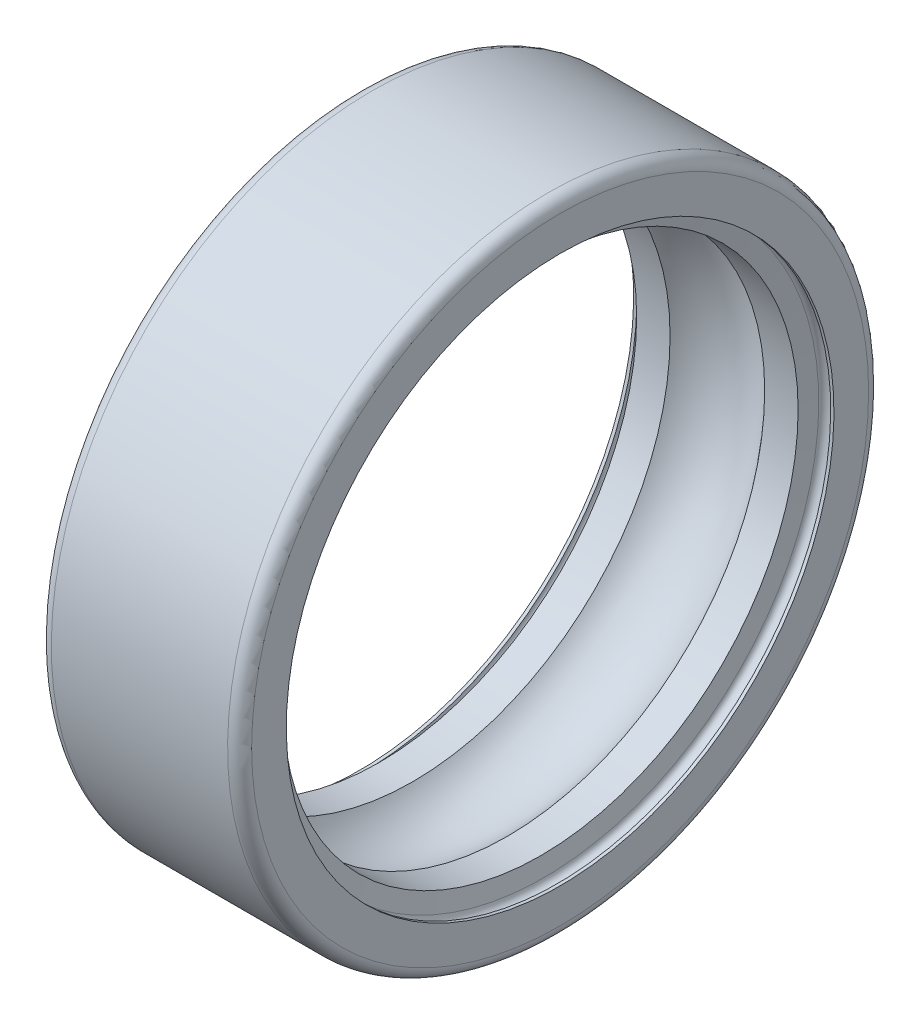
ISO-10303-21;
HEADER;
FILE_DESCRIPTION(('STEP AP214'),'2;1');
FILE_NAME('part.step','',(''),(''),'','','');
FILE_SCHEMA(('AUTOMOTIVE_DESIGN { 1 0 10303 214 1 1 1 1 }'));
ENDSEC;
DATA;
#1=APPLICATION_CONTEXT('core data for automotive mechanical design processes');
#2=APPLICATION_PROTOCOL_DEFINITION('international standard','automotive_design',2000,#1);
#3=PRODUCT_CONTEXT('',#1,'mechanical');
#4=PRODUCT('Part','Part','',(#3));
#5=PRODUCT_RELATED_PRODUCT_CATEGORY('part','',(#4));
#6=PRODUCT_DEFINITION_FORMATION('','',#4);
#7=PRODUCT_DEFINITION_CONTEXT('part definition',#1,'design');
#8=PRODUCT_DEFINITION('design','',#6,#7);
#9=PRODUCT_DEFINITION_SHAPE('','',#8);
#10=(LENGTH_UNIT() NAMED_UNIT(*) SI_UNIT(.MILLI.,.METRE.));
#11=(NAMED_UNIT(*) PLANE_ANGLE_UNIT() SI_UNIT($,.RADIAN.));
#12=(NAMED_UNIT(*) SI_UNIT($,.STERADIAN.) SOLID_ANGLE_UNIT());
#13=UNCERTAINTY_MEASURE_WITH_UNIT(LENGTH_MEASURE(1.E-05),#10,'distance_accuracy_value','');
#14=(GEOMETRIC_REPRESENTATION_CONTEXT(3) GLOBAL_UNCERTAINTY_ASSIGNED_CONTEXT((#13)) GLOBAL_UNIT_ASSIGNED_CONTEXT((#10,
#11,#12)) REPRESENTATION_CONTEXT('',''));
#15=CARTESIAN_POINT('',(0.,0.,0.));
#16=DIRECTION('',(0.,0.,1.));
#17=DIRECTION('',(1.,0.,0.));
#18=AXIS2_PLACEMENT_3D('',#15,#16,#17);
#19=CARTESIAN_POINT('',(9.508,0.,0.));
#20=DIRECTION('',(1.,0.,0.));
#21=DIRECTION('',(0.,0.,-1.));
#22=AXIS2_PLACEMENT_3D('',#19,#20,#21);
#23=TOROIDAL_SURFACE('',#22,13.67,0.328);
#24=CARTESIAN_POINT('',(9.836,0.,0.));
#25=DIRECTION('',(1.,0.,0.));
#26=DIRECTION('',(0.,1.,0.));
#27=AXIS2_PLACEMENT_3D('',#24,#25,#26);
#28=CIRCLE('',#27,13.67);
#29=CARTESIAN_POINT('',(9.836,13.67,0.));
#30=VERTEX_POINT('',#29);
#31=EDGE_CURVE('E10',#30,#30,#28,.T.);
#32=ORIENTED_EDGE('',*,*,#31,.T.);
#33=EDGE_LOOP('',(#32));
#34=FACE_BOUND('',#33,.T.);
#35=CARTESIAN_POINT('',(9.18498305701199,0.,0.));
#36=DIRECTION('',(1.,0.,0.));
#37=DIRECTION('',(0.,1.,0.));
#38=AXIS2_PLACEMENT_3D('',#35,#36,#37);
#39=CIRCLE('',#38,13.7269566022747);
#40=CARTESIAN_POINT('',(9.18498305701199,13.7269566022747,0.));
#41=VERTEX_POINT('',#40);
#42=EDGE_CURVE('E82',#41,#41,#39,.T.);
#43=ORIENTED_EDGE('',*,*,#42,.F.);
#44=EDGE_LOOP('',(#43));
#45=FACE_BOUND('',#44,.T.);
#46=ADVANCED_FACE('F15',(#34,#45),#23,.F.);
#47=CARTESIAN_POINT('',(9.918,0.,0.));
#48=DIRECTION('',(-1.,0.,0.));
#49=DIRECTION('',(0.,1.,0.));
#50=AXIS2_PLACEMENT_3D('',#47,#48,#49);
#51=CYLINDRICAL_SURFACE('',#50,13.67);
#52=CARTESIAN_POINT('',(10.,0.,0.));
#53=DIRECTION('',(1.,0.,0.));
#54=DIRECTION('',(0.,1.,0.));
#55=AXIS2_PLACEMENT_3D('',#52,#53,#54);
#56=CIRCLE('',#55,13.67);
#57=CARTESIAN_POINT('',(10.,13.67,0.));
#58=VERTEX_POINT('',#57);
#59=EDGE_CURVE('E25',#58,#58,#56,.T.);
#60=ORIENTED_EDGE('',*,*,#59,.T.);
#61=EDGE_LOOP('',(#60));
#62=FACE_BOUND('',#61,.T.);
#63=ORIENTED_EDGE('',*,*,#31,.F.);
#64=EDGE_LOOP('',(#63));
#65=FACE_BOUND('',#64,.T.);
#66=ADVANCED_FACE('F121',(#62,#65),#51,.F.);
#67=CARTESIAN_POINT('',(10.,14.535,0.));
#68=DIRECTION('',(1.,0.,0.));
#69=DIRECTION('',(0.,1.,0.));
#70=AXIS2_PLACEMENT_3D('',#67,#68,#69);
#71=PLANE('',#70);
#72=CARTESIAN_POINT('',(10.,0.,0.));
#73=DIRECTION('',(1.,0.,0.));
#74=DIRECTION('',(0.,1.,0.));
#75=AXIS2_PLACEMENT_3D('',#72,#73,#74);
#76=CIRCLE('',#75,15.4);
#77=CARTESIAN_POINT('',(10.,15.4,0.));
#78=VERTEX_POINT('',#77);
#79=EDGE_CURVE('E87',#78,#78,#76,.T.);
#80=ORIENTED_EDGE('',*,*,#79,.T.);
#81=EDGE_LOOP('',(#80));
#82=FACE_BOUND('',#81,.T.);
#83=ORIENTED_EDGE('',*,*,#59,.F.);
#84=EDGE_LOOP('',(#83));
#85=FACE_BOUND('',#84,.T.);
#86=ADVANCED_FACE('F125',(#82,#85),#71,.T.);
#87=CARTESIAN_POINT('',(9.4,0.,0.));
#88=DIRECTION('',(1.,0.,0.));
#89=DIRECTION('',(0.,0.,-1.));
#90=AXIS2_PLACEMENT_3D('',#87,#88,#89);
#91=TOROIDAL_SURFACE('',#90,15.4,0.6);
#92=CARTESIAN_POINT('',(9.4,0.,0.));
#93=DIRECTION('',(1.,0.,0.));
#94=DIRECTION('',(0.,1.,0.));
#95=AXIS2_PLACEMENT_3D('',#92,#93,#94);
#96=CIRCLE('',#95,16.);
#97=CARTESIAN_POINT('',(9.4,16.,0.));
#98=VERTEX_POINT('',#97);
#99=EDGE_CURVE('E85',#98,#98,#96,.T.);
#100=ORIENTED_EDGE('',*,*,#99,.T.);
#101=EDGE_LOOP('',(#100));
#102=FACE_BOUND('',#101,.T.);
#103=ORIENTED_EDGE('',*,*,#79,.F.);
#104=EDGE_LOOP('',(#103));
#105=FACE_BOUND('',#104,.T.);
#106=ADVANCED_FACE('F129',(#102,#105),#91,.T.);
#107=CARTESIAN_POINT('',(5.,0.,0.));
#108=DIRECTION('',(-1.,0.,0.));
#109=DIRECTION('',(0.,1.,0.));
#110=AXIS2_PLACEMENT_3D('',#107,#108,#109);
#111=CYLINDRICAL_SURFACE('',#110,16.);
#112=CARTESIAN_POINT('',(0.6,0.,0.));
#113=DIRECTION('',(1.,0.,0.));
#114=DIRECTION('',(0.,1.,0.));
#115=AXIS2_PLACEMENT_3D('',#112,#113,#114);
#116=CIRCLE('',#115,16.);
#117=CARTESIAN_POINT('',(0.6,16.,0.));
#118=VERTEX_POINT('',#117);
#119=EDGE_CURVE('E83',#118,#118,#116,.T.);
#120=ORIENTED_EDGE('',*,*,#119,.T.);
#121=EDGE_LOOP('',(#120));
#122=FACE_BOUND('',#121,.T.);
#123=ORIENTED_EDGE('',*,*,#99,.F.);
#124=EDGE_LOOP('',(#123));
#125=FACE_BOUND('',#124,.T.);
#126=ADVANCED_FACE('F131',(#122,#125),#111,.T.);
#127=CARTESIAN_POINT('',(0.6,0.,0.));
#128=DIRECTION('',(1.,0.,0.));
#129=DIRECTION('',(0.,0.,-1.));
#130=AXIS2_PLACEMENT_3D('',#127,#128,#129);
#131=TOROIDAL_SURFACE('',#130,15.4,0.6);
#132=CARTESIAN_POINT('',(0.,0.,0.));
#133=DIRECTION('',(1.,0.,0.));
#134=DIRECTION('',(0.,1.,0.));
#135=AXIS2_PLACEMENT_3D('',#132,#133,#134);
#136=CIRCLE('',#135,15.4);
#137=CARTESIAN_POINT('',(0.,15.4,0.));
#138=VERTEX_POINT('',#137);
#139=EDGE_CURVE('E86',#138,#138,#136,.T.);
#140=ORIENTED_EDGE('',*,*,#139,.T.);
#141=EDGE_LOOP('',(#140));
#142=FACE_BOUND('',#141,.T.);
#143=ORIENTED_EDGE('',*,*,#119,.F.);
#144=EDGE_LOOP('',(#143));
#145=FACE_BOUND('',#144,.T.);
#146=ADVANCED_FACE('F156',(#142,#145),#131,.T.);
#147=CARTESIAN_POINT('',(0.,14.535,0.));
#148=DIRECTION('',(-1.,0.,0.));
#149=DIRECTION('',(0.,-1.,0.));
#150=AXIS2_PLACEMENT_3D('',#147,#148,#149);
#151=PLANE('',#150);
#152=CARTESIAN_POINT('',(0.,0.,0.));
#153=DIRECTION('',(1.,0.,0.));
#154=DIRECTION('',(0.,1.,0.));
#155=AXIS2_PLACEMENT_3D('',#152,#153,#154);
#156=CIRCLE('',#155,13.67);
#157=CARTESIAN_POINT('',(0.,13.67,0.));
#158=VERTEX_POINT('',#157);
#159=EDGE_CURVE('E88',#158,#158,#156,.T.);
#160=ORIENTED_EDGE('',*,*,#159,.T.);
#161=EDGE_LOOP('',(#160));
#162=FACE_BOUND('',#161,.T.);
#163=ORIENTED_EDGE('',*,*,#139,.F.);
#164=EDGE_LOOP('',(#163));
#165=FACE_BOUND('',#164,.T.);
#166=ADVANCED_FACE('F148',(#162,#165),#151,.T.);
#167=CARTESIAN_POINT('',(0.081999999999999,0.,0.));
#168=DIRECTION('',(-1.,0.,0.));
#169=DIRECTION('',(0.,1.,0.));
#170=AXIS2_PLACEMENT_3D('',#167,#168,#169);
#171=CYLINDRICAL_SURFACE('',#170,13.67);
#172=CARTESIAN_POINT('',(0.164,0.,0.));
#173=DIRECTION('',(1.,0.,0.));
#174=DIRECTION('',(0.,1.,0.));
#175=AXIS2_PLACEMENT_3D('',#172,#173,#174);
#176=CIRCLE('',#175,13.67);
#177=CARTESIAN_POINT('',(0.164,13.67,0.));
#178=VERTEX_POINT('',#177);
#179=EDGE_CURVE('E74',#178,#178,#176,.T.);
#180=ORIENTED_EDGE('',*,*,#179,.T.);
#181=EDGE_LOOP('',(#180));
#182=FACE_BOUND('',#181,.T.);
#183=ORIENTED_EDGE('',*,*,#159,.F.);
#184=EDGE_LOOP('',(#183));
#185=FACE_BOUND('',#184,.T.);
#186=ADVANCED_FACE('F143',(#182,#185),#171,.F.);
#187=CARTESIAN_POINT('',(0.492,0.,0.));
#188=DIRECTION('',(1.,0.,0.));
#189=DIRECTION('',(0.,0.,-1.));
#190=AXIS2_PLACEMENT_3D('',#187,#188,#189);
#191=TOROIDAL_SURFACE('',#190,13.67,0.328);
#192=CARTESIAN_POINT('',(0.815016942988004,0.,0.));
#193=DIRECTION('',(1.,0.,0.));
#194=DIRECTION('',(0.,1.,0.));
#195=AXIS2_PLACEMENT_3D('',#192,#193,#194);
#196=CIRCLE('',#195,13.7269566022747);
#197=CARTESIAN_POINT('',(0.815016942988004,13.7269566022747,0.));
#198=VERTEX_POINT('',#197);
#199=EDGE_CURVE('E65',#198,#198,#196,.T.);
#200=ORIENTED_EDGE('',*,*,#199,.T.);
#201=EDGE_LOOP('',(#200));
#202=FACE_BOUND('',#201,.T.);
#203=ORIENTED_EDGE('',*,*,#179,.F.);
#204=EDGE_LOOP('',(#203));
#205=FACE_BOUND('',#204,.T.);
#206=ADVANCED_FACE('F138',(#202,#205),#191,.F.);
#207=CARTESIAN_POINT('',(0.892332497933735,0.,0.));
#208=DIRECTION('',(-1.,0.,0.));
#209=DIRECTION('',(0.,1.,0.));
#210=AXIS2_PLACEMENT_3D('',#207,#208,#209);
#211=CONICAL_SURFACE('',#210,13.2884783011374,1.39626340159546);
#212=CARTESIAN_POINT('',(0.969648052879466,0.,0.));
#213=DIRECTION('',(1.,0.,0.));
#214=DIRECTION('',(0.,1.,0.));
#215=AXIS2_PLACEMENT_3D('',#212,#213,#214);
#216=CIRCLE('',#215,12.85);
#217=CARTESIAN_POINT('',(0.969648052879466,12.85,0.));
#218=VERTEX_POINT('',#217);
#219=EDGE_CURVE('E70',#218,#218,#216,.T.);
#220=ORIENTED_EDGE('',*,*,#219,.T.);
#221=EDGE_LOOP('',(#220));
#222=FACE_BOUND('',#221,.T.);
#223=ORIENTED_EDGE('',*,*,#199,.F.);
#224=EDGE_LOOP('',(#223));
#225=FACE_BOUND('',#224,.T.);
#226=ADVANCED_FACE('F17',(#222,#225),#211,.F.);
#227=CARTESIAN_POINT('',(1.80398745857778,0.,0.));
#228=DIRECTION('',(-1.,0.,0.));
#229=DIRECTION('',(0.,1.,0.));
#230=AXIS2_PLACEMENT_3D('',#227,#228,#229);
#231=CYLINDRICAL_SURFACE('',#230,12.85);
#232=CARTESIAN_POINT('',(2.63832686427609,0.,0.));
#233=DIRECTION('',(1.,0.,0.));
#234=DIRECTION('',(0.,1.,0.));
#235=AXIS2_PLACEMENT_3D('',#232,#233,#234);
#236=CIRCLE('',#235,12.85);
#237=CARTESIAN_POINT('',(2.63832686427609,12.85,0.));
#238=VERTEX_POINT('',#237);
#239=EDGE_CURVE('E19',#238,#238,#236,.T.);
#240=ORIENTED_EDGE('',*,*,#239,.T.);
#241=EDGE_LOOP('',(#240));
#242=FACE_BOUND('',#241,.T.);
#243=ORIENTED_EDGE('',*,*,#219,.F.);
#244=EDGE_LOOP('',(#243));
#245=FACE_BOUND('',#244,.T.);
#246=ADVANCED_FACE('F116',(#242,#245),#231,.F.);
#247=CARTESIAN_POINT('',(5.,0.,0.));
#248=DIRECTION('',(1.,0.,0.));
#249=DIRECTION('',(0.,0.,-1.));
#250=AXIS2_PLACEMENT_3D('',#247,#248,#249);
#251=TOROIDAL_SURFACE('',#250,11.,3.);
#252=CARTESIAN_POINT('',(7.36167313572391,0.,0.));
#253=DIRECTION('',(1.,0.,0.));
#254=DIRECTION('',(0.,1.,0.));
#255=AXIS2_PLACEMENT_3D('',#252,#253,#254);
#256=CIRCLE('',#255,12.85);
#257=CARTESIAN_POINT('',(7.36167313572391,12.85,0.));
#258=VERTEX_POINT('',#257);
#259=EDGE_CURVE('E76',#258,#258,#256,.T.);
#260=ORIENTED_EDGE('',*,*,#259,.T.);
#261=EDGE_LOOP('',(#260));
#262=FACE_BOUND('',#261,.T.);
#263=ORIENTED_EDGE('',*,*,#239,.F.);
#264=EDGE_LOOP('',(#263));
#265=FACE_BOUND('',#264,.T.);
#266=ADVANCED_FACE('F102',(#262,#265),#251,.F.);
#267=CARTESIAN_POINT('',(8.19601254142222,0.,0.));
#268=DIRECTION('',(-1.,0.,0.));
#269=DIRECTION('',(0.,1.,0.));
#270=AXIS2_PLACEMENT_3D('',#267,#268,#269);
#271=CYLINDRICAL_SURFACE('',#270,12.85);
#272=CARTESIAN_POINT('',(9.03035194712053,0.,0.));
#273=DIRECTION('',(1.,0.,0.));
#274=DIRECTION('',(0.,1.,0.));
#275=AXIS2_PLACEMENT_3D('',#272,#273,#274);
#276=CIRCLE('',#275,12.85);
#277=CARTESIAN_POINT('',(9.03035194712053,12.85,0.));
#278=VERTEX_POINT('',#277);
#279=EDGE_CURVE('E80',#278,#278,#276,.T.);
#280=ORIENTED_EDGE('',*,*,#279,.T.);
#281=EDGE_LOOP('',(#280));
#282=FACE_BOUND('',#281,.T.);
#283=ORIENTED_EDGE('',*,*,#259,.F.);
#284=EDGE_LOOP('',(#283));
#285=FACE_BOUND('',#284,.T.);
#286=ADVANCED_FACE('F105',(#282,#285),#271,.F.);
#287=CARTESIAN_POINT('',(9.10766750206626,0.,0.));
#288=DIRECTION('',(1.,0.,0.));
#289=DIRECTION('',(0.,1.,0.));
#290=AXIS2_PLACEMENT_3D('',#287,#288,#289);
#291=CONICAL_SURFACE('',#290,13.2884783011374,1.39626340159546);
#292=ORIENTED_EDGE('',*,*,#42,.T.);
#293=EDGE_LOOP('',(#292));
#294=FACE_BOUND('',#293,.T.);
#295=ORIENTED_EDGE('',*,*,#279,.F.);
#296=EDGE_LOOP('',(#295));
#297=FACE_BOUND('',#296,.T.);
#298=ADVANCED_FACE('F107',(#294,#297),#291,.F.);
#299=CLOSED_SHELL('',(#46,#66,#86,#106,#126,#146,#166,#186,#206,#226,#246,#266,#286,#298));
#300=MANIFOLD_SOLID_BREP('B1',#299);
#301=ADVANCED_BREP_SHAPE_REPRESENTATION('',(#18,#300),#14);
#302=SHAPE_DEFINITION_REPRESENTATION(#9,#301);
ENDSEC;
END-ISO-10303-21;
